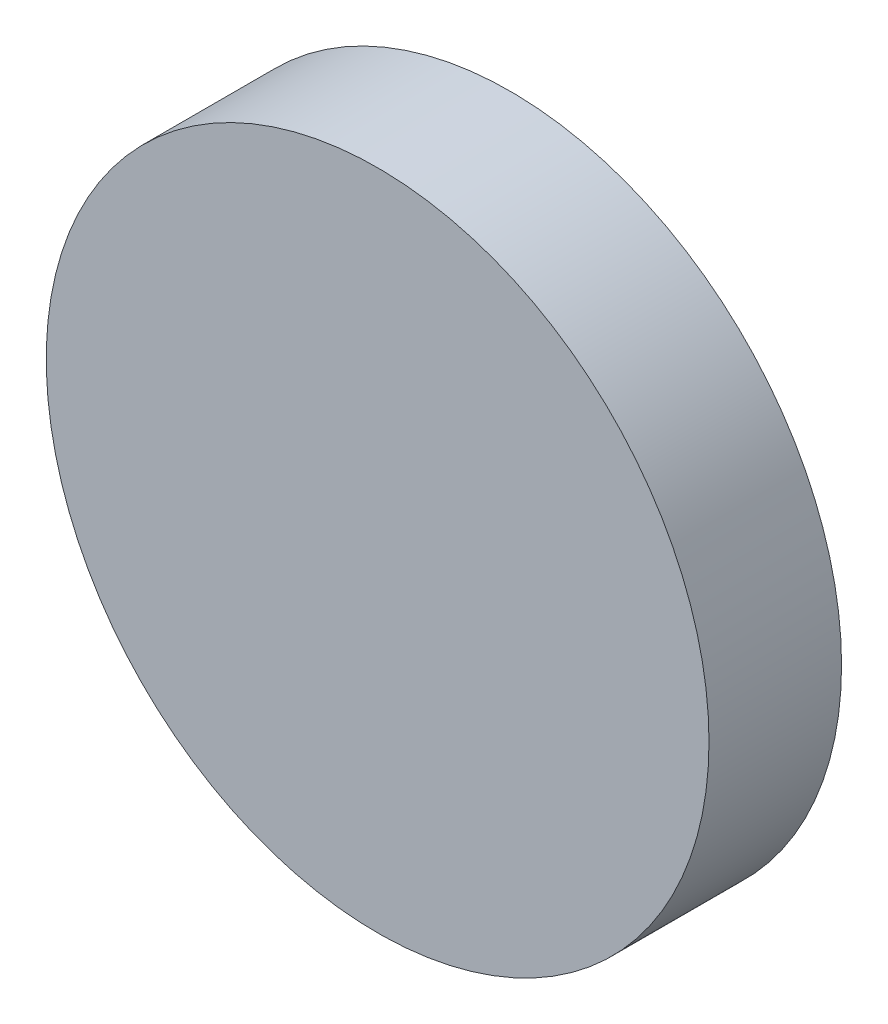
ISO-10303-21;
HEADER;
FILE_DESCRIPTION(('STEP AP214'),'2;1');
FILE_NAME('part.step','',(''),(''),'','','');
FILE_SCHEMA(('AUTOMOTIVE_DESIGN { 1 0 10303 214 1 1 1 1 }'));
ENDSEC;
DATA;
#1=APPLICATION_CONTEXT('core data for automotive mechanical design processes');
#2=APPLICATION_PROTOCOL_DEFINITION('international standard','automotive_design',2000,#1);
#3=PRODUCT_CONTEXT('',#1,'mechanical');
#4=PRODUCT('Part','Part','',(#3));
#5=PRODUCT_RELATED_PRODUCT_CATEGORY('part','',(#4));
#6=PRODUCT_DEFINITION_FORMATION('','',#4);
#7=PRODUCT_DEFINITION_CONTEXT('part definition',#1,'design');
#8=PRODUCT_DEFINITION('design','',#6,#7);
#9=PRODUCT_DEFINITION_SHAPE('','',#8);
#10=(LENGTH_UNIT() NAMED_UNIT(*) SI_UNIT(.MILLI.,.METRE.));
#11=(NAMED_UNIT(*) PLANE_ANGLE_UNIT() SI_UNIT($,.RADIAN.));
#12=(NAMED_UNIT(*) SI_UNIT($,.STERADIAN.) SOLID_ANGLE_UNIT());
#13=UNCERTAINTY_MEASURE_WITH_UNIT(LENGTH_MEASURE(1.E-05),#10,'distance_accuracy_value','');
#14=(GEOMETRIC_REPRESENTATION_CONTEXT(3) GLOBAL_UNCERTAINTY_ASSIGNED_CONTEXT((#13)) GLOBAL_UNIT_ASSIGNED_CONTEXT((#10,
#11,#12)) REPRESENTATION_CONTEXT('',''));
#15=CARTESIAN_POINT('',(0.,0.,0.));
#16=DIRECTION('',(0.,0.,1.));
#17=DIRECTION('',(1.,0.,0.));
#18=AXIS2_PLACEMENT_3D('',#15,#16,#17);
#19=CARTESIAN_POINT('',(-62.3905807956923,-116.,-3.));
#20=DIRECTION('',(0.,0.,1.));
#21=DIRECTION('',(1.,0.,0.));
#22=AXIS2_PLACEMENT_3D('',#19,#20,#21);
#23=CYLINDRICAL_SURFACE('',#22,7.50000000000001);
#24=CARTESIAN_POINT('',(-62.3905807956923,-116.,-3.));
#25=DIRECTION('',(0.,0.,1.));
#26=DIRECTION('',(1.,0.,0.));
#27=AXIS2_PLACEMENT_3D('',#24,#25,#26);
#28=CIRCLE('',#27,7.50000000000001);
#29=CARTESIAN_POINT('',(-54.8905807956923,-116.,-3.));
#30=VERTEX_POINT('',#29);
#31=EDGE_CURVE('E10',#30,#30,#28,.T.);
#32=ORIENTED_EDGE('',*,*,#31,.T.);
#33=EDGE_LOOP('',(#32));
#34=FACE_BOUND('',#33,.T.);
#35=CARTESIAN_POINT('',(-62.3905807956923,-116.,0.));
#36=DIRECTION('',(0.,0.,1.));
#37=DIRECTION('',(1.,0.,0.));
#38=AXIS2_PLACEMENT_3D('',#35,#36,#37);
#39=CIRCLE('',#38,7.50000000000001);
#40=CARTESIAN_POINT('',(-54.8905807956923,-116.,0.));
#41=VERTEX_POINT('',#40);
#42=EDGE_CURVE('E35',#41,#41,#39,.T.);
#43=ORIENTED_EDGE('',*,*,#42,.F.);
#44=EDGE_LOOP('',(#43));
#45=FACE_BOUND('',#44,.T.);
#46=ADVANCED_FACE('F32',(#34,#45),#23,.T.);
#47=CARTESIAN_POINT('',(-62.3905807956923,-116.,-3.));
#48=DIRECTION('',(0.,0.,1.));
#49=DIRECTION('',(1.,0.,0.));
#50=AXIS2_PLACEMENT_3D('',#47,#48,#49);
#51=PLANE('',#50);
#52=ORIENTED_EDGE('',*,*,#31,.F.);
#53=EDGE_LOOP('',(#52));
#54=FACE_BOUND('',#53,.T.);
#55=ADVANCED_FACE('F47',(#54),#51,.F.);
#56=CARTESIAN_POINT('',(-62.3905807956923,-116.,0.));
#57=DIRECTION('',(0.,0.,1.));
#58=DIRECTION('',(1.,0.,0.));
#59=AXIS2_PLACEMENT_3D('',#56,#57,#58);
#60=PLANE('',#59);
#61=ORIENTED_EDGE('',*,*,#42,.T.);
#62=EDGE_LOOP('',(#61));
#63=FACE_BOUND('',#62,.T.);
#64=ADVANCED_FACE('F44',(#63),#60,.T.);
#65=CLOSED_SHELL('',(#46,#55,#64));
#66=MANIFOLD_SOLID_BREP('B2',#65);
#67=ADVANCED_BREP_SHAPE_REPRESENTATION('',(#18,#66),#14);
#68=SHAPE_DEFINITION_REPRESENTATION(#9,#67);
ENDSEC;
END-ISO-10303-21;
